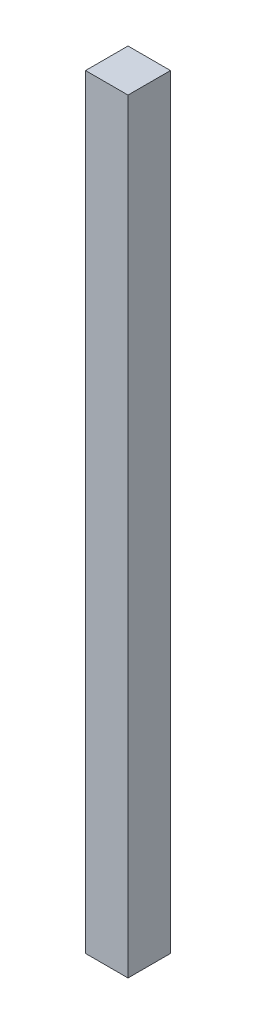
ISO-10303-21;
HEADER;
FILE_DESCRIPTION(('STEP AP214'),'2;1');
FILE_NAME('part.step','',(''),(''),'','','');
FILE_SCHEMA(('AUTOMOTIVE_DESIGN { 1 0 10303 214 1 1 1 1 }'));
ENDSEC;
DATA;
#1=APPLICATION_CONTEXT('core data for automotive mechanical design processes');
#2=APPLICATION_PROTOCOL_DEFINITION('international standard','automotive_design',2000,#1);
#3=PRODUCT_CONTEXT('',#1,'mechanical');
#4=PRODUCT('Part','Part','',(#3));
#5=PRODUCT_RELATED_PRODUCT_CATEGORY('part','',(#4));
#6=PRODUCT_DEFINITION_FORMATION('','',#4);
#7=PRODUCT_DEFINITION_CONTEXT('part definition',#1,'design');
#8=PRODUCT_DEFINITION('design','',#6,#7);
#9=PRODUCT_DEFINITION_SHAPE('','',#8);
#10=(LENGTH_UNIT() NAMED_UNIT(*) SI_UNIT(.MILLI.,.METRE.));
#11=(NAMED_UNIT(*) PLANE_ANGLE_UNIT() SI_UNIT($,.RADIAN.));
#12=(NAMED_UNIT(*) SI_UNIT($,.STERADIAN.) SOLID_ANGLE_UNIT());
#13=UNCERTAINTY_MEASURE_WITH_UNIT(LENGTH_MEASURE(1.E-05),#10,'distance_accuracy_value','');
#14=(GEOMETRIC_REPRESENTATION_CONTEXT(3) GLOBAL_UNCERTAINTY_ASSIGNED_CONTEXT((#13)) GLOBAL_UNIT_ASSIGNED_CONTEXT((#10,
#11,#12)) REPRESENTATION_CONTEXT('',''));
#15=CARTESIAN_POINT('',(0.,0.,0.));
#16=DIRECTION('',(0.,0.,1.));
#17=DIRECTION('',(1.,0.,0.));
#18=AXIS2_PLACEMENT_3D('',#15,#16,#17);
#19=CARTESIAN_POINT('',(0.,270.,0.));
#20=DIRECTION('',(-1.,0.,0.));
#21=DIRECTION('',(0.,0.,1.));
#22=AXIS2_PLACEMENT_3D('',#19,#20,#21);
#23=PLANE('',#22);
#24=DIRECTION('',(0.,0.,-1.));
#25=VECTOR('',#24,1.);
#26=CARTESIAN_POINT('',(0.,0.,0.));
#27=LINE('',#26,#25);
#28=CARTESIAN_POINT('',(0.,0.,0.));
#29=VERTEX_POINT('',#28);
#30=CARTESIAN_POINT('',(0.,0.,-15.));
#31=VERTEX_POINT('',#30);
#32=EDGE_CURVE('E104',#29,#31,#27,.T.);
#33=ORIENTED_EDGE('',*,*,#32,.F.);
#34=DIRECTION('',(0.,-1.,0.));
#35=VECTOR('',#34,1.);
#36=CARTESIAN_POINT('',(0.,270.,0.));
#37=LINE('',#36,#35);
#38=CARTESIAN_POINT('',(0.,270.,0.));
#39=VERTEX_POINT('',#38);
#40=EDGE_CURVE('E11',#39,#29,#37,.T.);
#41=ORIENTED_EDGE('',*,*,#40,.F.);
#42=DIRECTION('',(0.,0.,-1.));
#43=VECTOR('',#42,1.);
#44=CARTESIAN_POINT('',(0.,270.,0.));
#45=LINE('',#44,#43);
#46=CARTESIAN_POINT('',(0.,270.,-15.));
#47=VERTEX_POINT('',#46);
#48=EDGE_CURVE('E99',#39,#47,#45,.T.);
#49=ORIENTED_EDGE('',*,*,#48,.T.);
#50=DIRECTION('',(0.,-1.,0.));
#51=VECTOR('',#50,1.);
#52=CARTESIAN_POINT('',(0.,270.,-15.));
#53=LINE('',#52,#51);
#54=EDGE_CURVE('E42',#47,#31,#53,.T.);
#55=ORIENTED_EDGE('',*,*,#54,.T.);
#56=EDGE_LOOP('',(#33,#41,#49,#55));
#57=FACE_BOUND('',#56,.T.);
#58=ADVANCED_FACE('F39',(#57),#23,.T.);
#59=CARTESIAN_POINT('',(0.,270.,0.));
#60=DIRECTION('',(0.,0.,-1.));
#61=DIRECTION('',(-1.,0.,0.));
#62=AXIS2_PLACEMENT_3D('',#59,#60,#61);
#63=PLANE('',#62);
#64=DIRECTION('',(1.,0.,0.));
#65=VECTOR('',#64,1.);
#66=CARTESIAN_POINT('',(0.,0.,0.));
#67=LINE('',#66,#65);
#68=CARTESIAN_POINT('',(15.,0.,0.));
#69=VERTEX_POINT('',#68);
#70=EDGE_CURVE('E72',#29,#69,#67,.T.);
#71=ORIENTED_EDGE('',*,*,#70,.T.);
#72=DIRECTION('',(0.,-1.,0.));
#73=VECTOR('',#72,1.);
#74=CARTESIAN_POINT('',(15.,270.,0.));
#75=LINE('',#74,#73);
#76=CARTESIAN_POINT('',(15.,270.,0.));
#77=VERTEX_POINT('',#76);
#78=EDGE_CURVE('E48',#77,#69,#75,.T.);
#79=ORIENTED_EDGE('',*,*,#78,.F.);
#80=DIRECTION('',(1.,0.,0.));
#81=VECTOR('',#80,1.);
#82=CARTESIAN_POINT('',(0.,270.,0.));
#83=LINE('',#82,#81);
#84=EDGE_CURVE('E89',#39,#77,#83,.T.);
#85=ORIENTED_EDGE('',*,*,#84,.F.);
#86=ORIENTED_EDGE('',*,*,#40,.T.);
#87=EDGE_LOOP('',(#71,#79,#85,#86));
#88=FACE_BOUND('',#87,.T.);
#89=ADVANCED_FACE('F114',(#88),#63,.F.);
#90=CARTESIAN_POINT('',(15.,270.,0.));
#91=DIRECTION('',(-1.,0.,0.));
#92=DIRECTION('',(0.,0.,1.));
#93=AXIS2_PLACEMENT_3D('',#90,#91,#92);
#94=PLANE('',#93);
#95=DIRECTION('',(0.,0.,-1.));
#96=VECTOR('',#95,1.);
#97=CARTESIAN_POINT('',(15.,0.,0.));
#98=LINE('',#97,#96);
#99=CARTESIAN_POINT('',(15.,0.,-15.));
#100=VERTEX_POINT('',#99);
#101=EDGE_CURVE('E96',#69,#100,#98,.T.);
#102=ORIENTED_EDGE('',*,*,#101,.T.);
#103=DIRECTION('',(0.,-1.,0.));
#104=VECTOR('',#103,1.);
#105=CARTESIAN_POINT('',(15.,270.,-15.));
#106=LINE('',#105,#104);
#107=CARTESIAN_POINT('',(15.,270.,-15.));
#108=VERTEX_POINT('',#107);
#109=EDGE_CURVE('E93',#108,#100,#106,.T.);
#110=ORIENTED_EDGE('',*,*,#109,.F.);
#111=DIRECTION('',(0.,0.,-1.));
#112=VECTOR('',#111,1.);
#113=CARTESIAN_POINT('',(15.,270.,0.));
#114=LINE('',#113,#112);
#115=EDGE_CURVE('E84',#77,#108,#114,.T.);
#116=ORIENTED_EDGE('',*,*,#115,.F.);
#117=ORIENTED_EDGE('',*,*,#78,.T.);
#118=EDGE_LOOP('',(#102,#110,#116,#117));
#119=FACE_BOUND('',#118,.T.);
#120=ADVANCED_FACE('F94',(#119),#94,.F.);
#121=CARTESIAN_POINT('',(0.,270.,-15.));
#122=DIRECTION('',(0.,0.,-1.));
#123=DIRECTION('',(-1.,0.,0.));
#124=AXIS2_PLACEMENT_3D('',#121,#122,#123);
#125=PLANE('',#124);
#126=DIRECTION('',(1.,0.,0.));
#127=VECTOR('',#126,1.);
#128=CARTESIAN_POINT('',(0.,0.,-15.));
#129=LINE('',#128,#127);
#130=EDGE_CURVE('E107',#31,#100,#129,.T.);
#131=ORIENTED_EDGE('',*,*,#130,.F.);
#132=ORIENTED_EDGE('',*,*,#54,.F.);
#133=DIRECTION('',(1.,0.,0.));
#134=VECTOR('',#133,1.);
#135=CARTESIAN_POINT('',(0.,270.,-15.));
#136=LINE('',#135,#134);
#137=EDGE_CURVE('E88',#47,#108,#136,.T.);
#138=ORIENTED_EDGE('',*,*,#137,.T.);
#139=ORIENTED_EDGE('',*,*,#109,.T.);
#140=EDGE_LOOP('',(#131,#132,#138,#139));
#141=FACE_BOUND('',#140,.T.);
#142=ADVANCED_FACE('F98',(#141),#125,.T.);
#143=CARTESIAN_POINT('',(0.,270.,0.));
#144=DIRECTION('',(0.,-1.,0.));
#145=DIRECTION('',(0.,0.,-1.));
#146=AXIS2_PLACEMENT_3D('',#143,#144,#145);
#147=PLANE('',#146);
#148=ORIENTED_EDGE('',*,*,#48,.F.);
#149=ORIENTED_EDGE('',*,*,#84,.T.);
#150=ORIENTED_EDGE('',*,*,#115,.T.);
#151=ORIENTED_EDGE('',*,*,#137,.F.);
#152=EDGE_LOOP('',(#148,#149,#150,#151));
#153=FACE_BOUND('',#152,.T.);
#154=ADVANCED_FACE('F87',(#153),#147,.F.);
#155=CARTESIAN_POINT('',(0.,0.,0.));
#156=DIRECTION('',(0.,-1.,0.));
#157=DIRECTION('',(0.,0.,-1.));
#158=AXIS2_PLACEMENT_3D('',#155,#156,#157);
#159=PLANE('',#158);
#160=ORIENTED_EDGE('',*,*,#32,.T.);
#161=ORIENTED_EDGE('',*,*,#130,.T.);
#162=ORIENTED_EDGE('',*,*,#101,.F.);
#163=ORIENTED_EDGE('',*,*,#70,.F.);
#164=EDGE_LOOP('',(#160,#161,#162,#163));
#165=FACE_BOUND('',#164,.T.);
#166=ADVANCED_FACE('F112',(#165),#159,.T.);
#167=CLOSED_SHELL('',(#58,#89,#120,#142,#154,#166));
#168=MANIFOLD_SOLID_BREP('B2',#167);
#169=ADVANCED_BREP_SHAPE_REPRESENTATION('',(#18,#168),#14);
#170=SHAPE_DEFINITION_REPRESENTATION(#9,#169);
ENDSEC;
END-ISO-10303-21;
